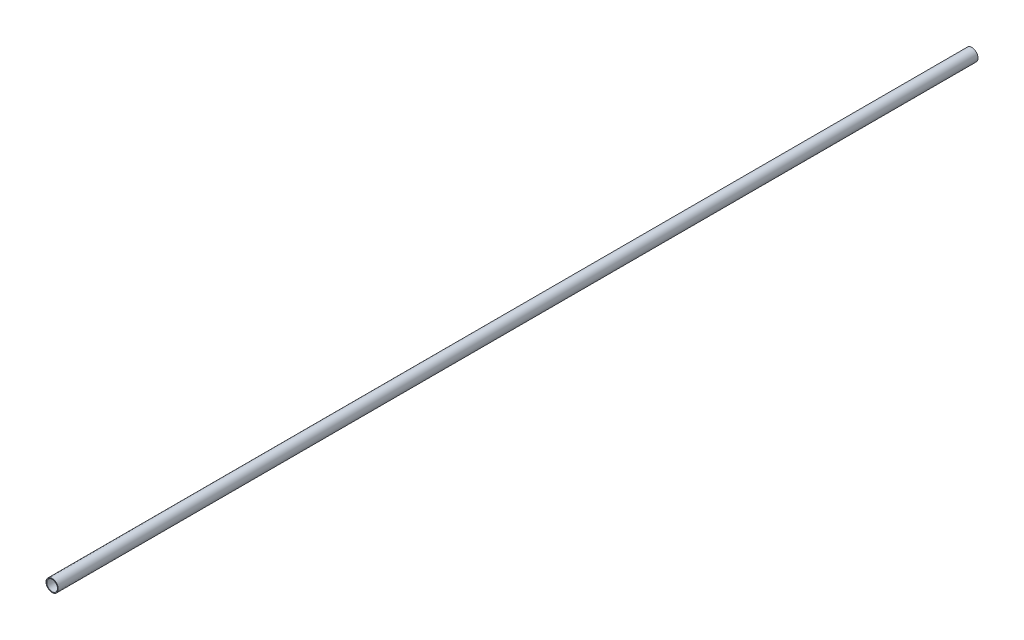
ISO-10303-21;
HEADER;
FILE_DESCRIPTION(('STEP AP214'),'2;1');
FILE_NAME('part.step','',(''),(''),'','','');
FILE_SCHEMA(('AUTOMOTIVE_DESIGN { 1 0 10303 214 1 1 1 1 }'));
ENDSEC;
DATA;
#1=APPLICATION_CONTEXT('core data for automotive mechanical design processes');
#2=APPLICATION_PROTOCOL_DEFINITION('international standard','automotive_design',2000,#1);
#3=PRODUCT_CONTEXT('',#1,'mechanical');
#4=PRODUCT('Part','Part','',(#3));
#5=PRODUCT_RELATED_PRODUCT_CATEGORY('part','',(#4));
#6=PRODUCT_DEFINITION_FORMATION('','',#4);
#7=PRODUCT_DEFINITION_CONTEXT('part definition',#1,'design');
#8=PRODUCT_DEFINITION('design','',#6,#7);
#9=PRODUCT_DEFINITION_SHAPE('','',#8);
#10=(LENGTH_UNIT() NAMED_UNIT(*) SI_UNIT(.MILLI.,.METRE.));
#11=(NAMED_UNIT(*) PLANE_ANGLE_UNIT() SI_UNIT($,.RADIAN.));
#12=(NAMED_UNIT(*) SI_UNIT($,.STERADIAN.) SOLID_ANGLE_UNIT());
#13=UNCERTAINTY_MEASURE_WITH_UNIT(LENGTH_MEASURE(1.E-05),#10,'distance_accuracy_value','');
#14=(GEOMETRIC_REPRESENTATION_CONTEXT(3) GLOBAL_UNCERTAINTY_ASSIGNED_CONTEXT((#13)) GLOBAL_UNIT_ASSIGNED_CONTEXT((#10,
#11,#12)) REPRESENTATION_CONTEXT('',''));
#15=CARTESIAN_POINT('',(0.,0.,0.));
#16=DIRECTION('',(0.,0.,1.));
#17=DIRECTION('',(1.,0.,0.));
#18=AXIS2_PLACEMENT_3D('',#15,#16,#17);
#19=CARTESIAN_POINT('',(0.,0.,600.));
#20=DIRECTION('',(0.,0.,1.));
#21=DIRECTION('',(1.,0.,0.));
#22=AXIS2_PLACEMENT_3D('',#19,#20,#21);
#23=PLANE('',#22);
#24=CARTESIAN_POINT('',(0.,0.,600.));
#25=DIRECTION('',(0.,0.,1.));
#26=DIRECTION('',(1.,0.,0.));
#27=AXIS2_PLACEMENT_3D('',#24,#25,#26);
#28=CIRCLE('',#27,8.);
#29=CARTESIAN_POINT('',(8.,0.,600.));
#30=VERTEX_POINT('',#29);
#31=EDGE_CURVE('E10',#30,#30,#28,.T.);
#32=ORIENTED_EDGE('',*,*,#31,.T.);
#33=EDGE_LOOP('',(#32));
#34=FACE_BOUND('',#33,.T.);
#35=CARTESIAN_POINT('',(0.,0.,600.));
#36=DIRECTION('',(0.,0.,1.));
#37=DIRECTION('',(1.,0.,0.));
#38=AXIS2_PLACEMENT_3D('',#35,#36,#37);
#39=CIRCLE('',#38,7.);
#40=CARTESIAN_POINT('',(7.,0.,600.));
#41=VERTEX_POINT('',#40);
#42=EDGE_CURVE('E50',#41,#41,#39,.T.);
#43=ORIENTED_EDGE('',*,*,#42,.F.);
#44=EDGE_LOOP('',(#43));
#45=FACE_BOUND('',#44,.T.);
#46=ADVANCED_FACE('F37',(#34,#45),#23,.T.);
#47=CARTESIAN_POINT('',(0.,0.,-600.));
#48=DIRECTION('',(0.,0.,1.));
#49=DIRECTION('',(1.,0.,0.));
#50=AXIS2_PLACEMENT_3D('',#47,#48,#49);
#51=PLANE('',#50);
#52=CARTESIAN_POINT('',(0.,0.,-600.));
#53=DIRECTION('',(0.,0.,1.));
#54=DIRECTION('',(1.,0.,0.));
#55=AXIS2_PLACEMENT_3D('',#52,#53,#54);
#56=CIRCLE('',#55,8.);
#57=CARTESIAN_POINT('',(8.,0.,-600.));
#58=VERTEX_POINT('',#57);
#59=EDGE_CURVE('E41',#58,#58,#56,.T.);
#60=ORIENTED_EDGE('',*,*,#59,.F.);
#61=EDGE_LOOP('',(#60));
#62=FACE_BOUND('',#61,.T.);
#63=CARTESIAN_POINT('',(0.,0.,-600.));
#64=DIRECTION('',(0.,0.,1.));
#65=DIRECTION('',(1.,0.,0.));
#66=AXIS2_PLACEMENT_3D('',#63,#64,#65);
#67=CIRCLE('',#66,7.);
#68=CARTESIAN_POINT('',(7.,0.,-600.));
#69=VERTEX_POINT('',#68);
#70=EDGE_CURVE('E52',#69,#69,#67,.T.);
#71=ORIENTED_EDGE('',*,*,#70,.T.);
#72=EDGE_LOOP('',(#71));
#73=FACE_BOUND('',#72,.T.);
#74=ADVANCED_FACE('F64',(#62,#73),#51,.F.);
#75=CARTESIAN_POINT('',(0.,0.,600.));
#76=DIRECTION('',(0.,0.,-1.));
#77=DIRECTION('',(-1.,0.,0.));
#78=AXIS2_PLACEMENT_3D('',#75,#76,#77);
#79=CYLINDRICAL_SURFACE('',#78,8.);
#80=ORIENTED_EDGE('',*,*,#31,.F.);
#81=EDGE_LOOP('',(#80));
#82=FACE_BOUND('',#81,.T.);
#83=ORIENTED_EDGE('',*,*,#59,.T.);
#84=EDGE_LOOP('',(#83));
#85=FACE_BOUND('',#84,.T.);
#86=ADVANCED_FACE('F39',(#82,#85),#79,.T.);
#87=CARTESIAN_POINT('',(0.,0.,600.));
#88=DIRECTION('',(0.,0.,-1.));
#89=DIRECTION('',(-1.,0.,0.));
#90=AXIS2_PLACEMENT_3D('',#87,#88,#89);
#91=CYLINDRICAL_SURFACE('',#90,7.);
#92=ORIENTED_EDGE('',*,*,#42,.T.);
#93=EDGE_LOOP('',(#92));
#94=FACE_BOUND('',#93,.T.);
#95=ORIENTED_EDGE('',*,*,#70,.F.);
#96=EDGE_LOOP('',(#95));
#97=FACE_BOUND('',#96,.T.);
#98=ADVANCED_FACE('F60',(#94,#97),#91,.F.);
#99=CLOSED_SHELL('',(#46,#74,#86,#98));
#100=MANIFOLD_SOLID_BREP('B2',#99);
#101=ADVANCED_BREP_SHAPE_REPRESENTATION('',(#18,#100),#14);
#102=SHAPE_DEFINITION_REPRESENTATION(#9,#101);
ENDSEC;
END-ISO-10303-21;
